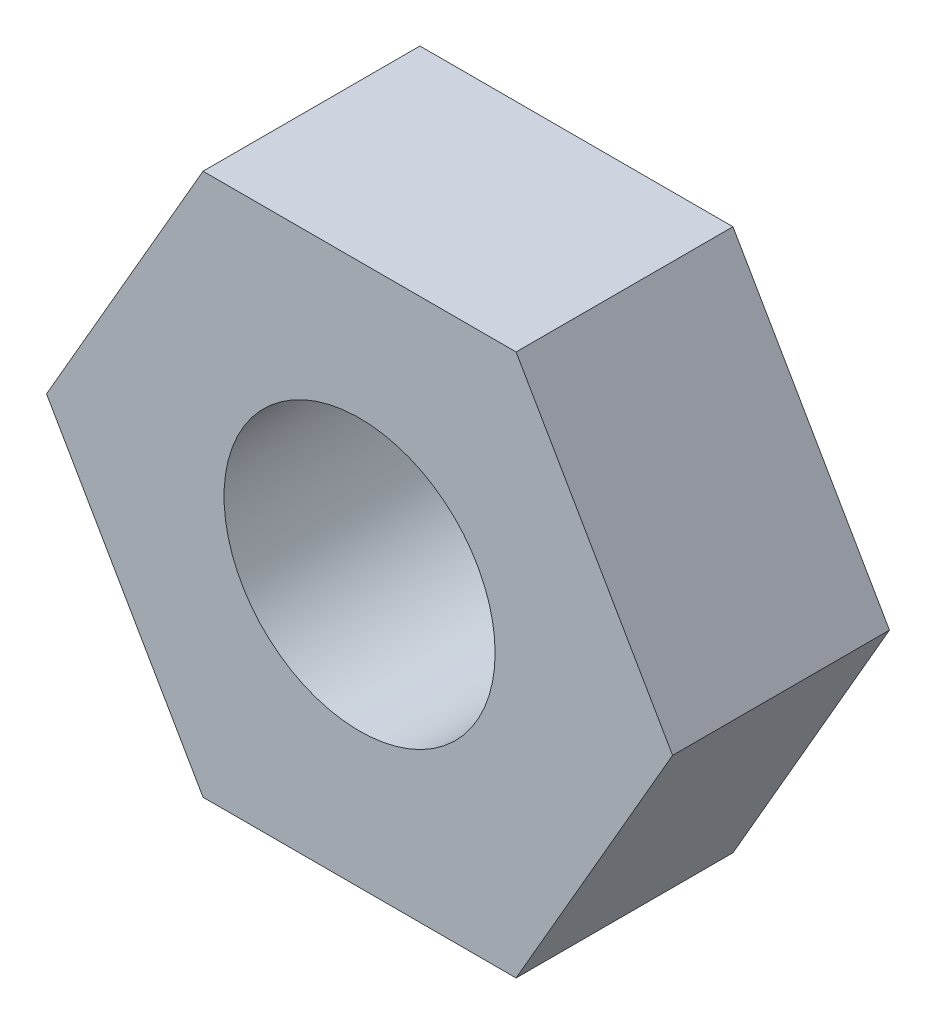
ISO-10303-21;
HEADER;
FILE_DESCRIPTION(('STEP AP214'),'2;1');
FILE_NAME('part.step','',(''),(''),'','','');
FILE_SCHEMA(('AUTOMOTIVE_DESIGN { 1 0 10303 214 1 1 1 1 }'));
ENDSEC;
DATA;
#1=APPLICATION_CONTEXT('core data for automotive mechanical design processes');
#2=APPLICATION_PROTOCOL_DEFINITION('international standard','automotive_design',2000,#1);
#3=PRODUCT_CONTEXT('',#1,'mechanical');
#4=PRODUCT('Part','Part','',(#3));
#5=PRODUCT_RELATED_PRODUCT_CATEGORY('part','',(#4));
#6=PRODUCT_DEFINITION_FORMATION('','',#4);
#7=PRODUCT_DEFINITION_CONTEXT('part definition',#1,'design');
#8=PRODUCT_DEFINITION('design','',#6,#7);
#9=PRODUCT_DEFINITION_SHAPE('','',#8);
#10=(LENGTH_UNIT() NAMED_UNIT(*) SI_UNIT(.MILLI.,.METRE.));
#11=(NAMED_UNIT(*) PLANE_ANGLE_UNIT() SI_UNIT($,.RADIAN.));
#12=(NAMED_UNIT(*) SI_UNIT($,.STERADIAN.) SOLID_ANGLE_UNIT());
#13=UNCERTAINTY_MEASURE_WITH_UNIT(LENGTH_MEASURE(1.E-05),#10,'distance_accuracy_value','');
#14=(GEOMETRIC_REPRESENTATION_CONTEXT(3) GLOBAL_UNCERTAINTY_ASSIGNED_CONTEXT((#13)) GLOBAL_UNIT_ASSIGNED_CONTEXT((#10,
#11,#12)) REPRESENTATION_CONTEXT('',''));
#15=CARTESIAN_POINT('',(0.,0.,0.));
#16=DIRECTION('',(0.,0.,1.));
#17=DIRECTION('',(1.,0.,0.));
#18=AXIS2_PLACEMENT_3D('',#15,#16,#17);
#19=CARTESIAN_POINT('',(0.,0.,1.6));
#20=DIRECTION('',(0.,0.,1.));
#21=DIRECTION('',(1.,0.,0.));
#22=AXIS2_PLACEMENT_3D('',#19,#20,#21);
#23=PLANE('',#22);
#24=DIRECTION('',(0.5,0.866025403784439,0.));
#25=VECTOR('',#24,1.);
#26=CARTESIAN_POINT('',(1.15470053837925,-2.,1.6));
#27=LINE('',#26,#25);
#28=CARTESIAN_POINT('',(1.15470053837925,-2.,1.6));
#29=VERTEX_POINT('',#28);
#30=CARTESIAN_POINT('',(2.3094010767585,0.,1.6));
#31=VERTEX_POINT('',#30);
#32=EDGE_CURVE('E134',#29,#31,#27,.T.);
#33=ORIENTED_EDGE('',*,*,#32,.T.);
#34=DIRECTION('',(-0.5,0.866025403784439,0.));
#35=VECTOR('',#34,1.);
#36=CARTESIAN_POINT('',(2.3094010767585,0.,1.6));
#37=LINE('',#36,#35);
#38=CARTESIAN_POINT('',(1.15470053837925,2.,1.6));
#39=VERTEX_POINT('',#38);
#40=EDGE_CURVE('E93',#31,#39,#37,.T.);
#41=ORIENTED_EDGE('',*,*,#40,.T.);
#42=DIRECTION('',(-1.,0.,0.));
#43=VECTOR('',#42,1.);
#44=CARTESIAN_POINT('',(1.15470053837925,2.,1.6));
#45=LINE('',#44,#43);
#46=CARTESIAN_POINT('',(-1.15470053837925,2.,1.6));
#47=VERTEX_POINT('',#46);
#48=EDGE_CURVE('E106',#39,#47,#45,.T.);
#49=ORIENTED_EDGE('',*,*,#48,.T.);
#50=DIRECTION('',(-0.5,-0.866025403784439,0.));
#51=VECTOR('',#50,1.);
#52=CARTESIAN_POINT('',(-1.15470053837925,2.,1.6));
#53=LINE('',#52,#51);
#54=CARTESIAN_POINT('',(-2.3094010767585,0.,1.6));
#55=VERTEX_POINT('',#54);
#56=EDGE_CURVE('E99',#47,#55,#53,.T.);
#57=ORIENTED_EDGE('',*,*,#56,.T.);
#58=DIRECTION('',(0.5,-0.866025403784439,0.));
#59=VECTOR('',#58,1.);
#60=CARTESIAN_POINT('',(-2.3094010767585,0.,1.6));
#61=LINE('',#60,#59);
#62=CARTESIAN_POINT('',(-1.15470053837925,-2.,1.6));
#63=VERTEX_POINT('',#62);
#64=EDGE_CURVE('E104',#55,#63,#61,.T.);
#65=ORIENTED_EDGE('',*,*,#64,.T.);
#66=DIRECTION('',(1.,0.,0.));
#67=VECTOR('',#66,1.);
#68=CARTESIAN_POINT('',(-1.15470053837925,-2.,1.6));
#69=LINE('',#68,#67);
#70=EDGE_CURVE('E57',#63,#29,#69,.T.);
#71=ORIENTED_EDGE('',*,*,#70,.T.);
#72=EDGE_LOOP('',(#33,#41,#49,#57,#65,#71));
#73=FACE_BOUND('',#72,.T.);
#74=CARTESIAN_POINT('',(0.,0.,1.6));
#75=DIRECTION('',(0.,0.,1.));
#76=DIRECTION('',(1.,0.,0.));
#77=AXIS2_PLACEMENT_3D('',#74,#75,#76);
#78=CIRCLE('',#77,1.);
#79=CARTESIAN_POINT('',(1.,0.,1.6));
#80=VERTEX_POINT('',#79);
#81=EDGE_CURVE('E127',#80,#80,#78,.T.);
#82=ORIENTED_EDGE('',*,*,#81,.F.);
#83=EDGE_LOOP('',(#82));
#84=FACE_BOUND('',#83,.T.);
#85=ADVANCED_FACE('F39',(#73,#84),#23,.T.);
#86=CARTESIAN_POINT('',(0.,0.,0.));
#87=DIRECTION('',(0.,0.,1.));
#88=DIRECTION('',(1.,0.,0.));
#89=AXIS2_PLACEMENT_3D('',#86,#87,#88);
#90=PLANE('',#89);
#91=DIRECTION('',(0.5,0.866025403784439,0.));
#92=VECTOR('',#91,1.);
#93=CARTESIAN_POINT('',(1.15470053837925,-2.,0.));
#94=LINE('',#93,#92);
#95=CARTESIAN_POINT('',(1.15470053837925,-2.,0.));
#96=VERTEX_POINT('',#95);
#97=CARTESIAN_POINT('',(2.3094010767585,0.,0.));
#98=VERTEX_POINT('',#97);
#99=EDGE_CURVE('E121',#96,#98,#94,.T.);
#100=ORIENTED_EDGE('',*,*,#99,.F.);
#101=DIRECTION('',(1.,0.,0.));
#102=VECTOR('',#101,1.);
#103=CARTESIAN_POINT('',(-1.15470053837925,-2.,0.));
#104=LINE('',#103,#102);
#105=CARTESIAN_POINT('',(-1.15470053837925,-2.,0.));
#106=VERTEX_POINT('',#105);
#107=EDGE_CURVE('E84',#106,#96,#104,.T.);
#108=ORIENTED_EDGE('',*,*,#107,.F.);
#109=DIRECTION('',(0.5,-0.866025403784439,0.));
#110=VECTOR('',#109,1.);
#111=CARTESIAN_POINT('',(-2.3094010767585,0.,0.));
#112=LINE('',#111,#110);
#113=CARTESIAN_POINT('',(-2.3094010767585,0.,0.));
#114=VERTEX_POINT('',#113);
#115=EDGE_CURVE('E79',#114,#106,#112,.T.);
#116=ORIENTED_EDGE('',*,*,#115,.F.);
#117=DIRECTION('',(-0.5,-0.866025403784439,0.));
#118=VECTOR('',#117,1.);
#119=CARTESIAN_POINT('',(-1.15470053837925,2.,0.));
#120=LINE('',#119,#118);
#121=CARTESIAN_POINT('',(-1.15470053837925,2.,0.));
#122=VERTEX_POINT('',#121);
#123=EDGE_CURVE('E112',#122,#114,#120,.T.);
#124=ORIENTED_EDGE('',*,*,#123,.F.);
#125=DIRECTION('',(-1.,0.,0.));
#126=VECTOR('',#125,1.);
#127=CARTESIAN_POINT('',(1.15470053837925,2.,0.));
#128=LINE('',#127,#126);
#129=CARTESIAN_POINT('',(1.15470053837925,2.,0.));
#130=VERTEX_POINT('',#129);
#131=EDGE_CURVE('E129',#130,#122,#128,.T.);
#132=ORIENTED_EDGE('',*,*,#131,.F.);
#133=DIRECTION('',(-0.5,0.866025403784439,0.));
#134=VECTOR('',#133,1.);
#135=CARTESIAN_POINT('',(2.3094010767585,0.,0.));
#136=LINE('',#135,#134);
#137=EDGE_CURVE('E130',#98,#130,#136,.T.);
#138=ORIENTED_EDGE('',*,*,#137,.F.);
#139=EDGE_LOOP('',(#100,#108,#116,#124,#132,#138));
#140=FACE_BOUND('',#139,.T.);
#141=CARTESIAN_POINT('',(0.,0.,0.));
#142=DIRECTION('',(0.,0.,1.));
#143=DIRECTION('',(1.,0.,0.));
#144=AXIS2_PLACEMENT_3D('',#141,#142,#143);
#145=CIRCLE('',#144,1.);
#146=CARTESIAN_POINT('',(1.,0.,0.));
#147=VERTEX_POINT('',#146);
#148=EDGE_CURVE('E226',#147,#147,#145,.T.);
#149=ORIENTED_EDGE('',*,*,#148,.T.);
#150=EDGE_LOOP('',(#149));
#151=FACE_BOUND('',#150,.T.);
#152=ADVANCED_FACE('F144',(#140,#151),#90,.F.);
#153=CARTESIAN_POINT('',(1.15470053837925,-2.,1.6));
#154=DIRECTION('',(-0.866025403784439,0.5,0.));
#155=DIRECTION('',(-0.5,-0.866025403784439,0.));
#156=AXIS2_PLACEMENT_3D('',#153,#154,#155);
#157=PLANE('',#156);
#158=ORIENTED_EDGE('',*,*,#99,.T.);
#159=DIRECTION('',(0.,0.,-1.));
#160=VECTOR('',#159,1.);
#161=CARTESIAN_POINT('',(2.3094010767585,0.,1.6));
#162=LINE('',#161,#160);
#163=EDGE_CURVE('E11',#31,#98,#162,.T.);
#164=ORIENTED_EDGE('',*,*,#163,.F.);
#165=ORIENTED_EDGE('',*,*,#32,.F.);
#166=DIRECTION('',(0.,0.,-1.));
#167=VECTOR('',#166,1.);
#168=CARTESIAN_POINT('',(1.15470053837925,-2.,1.6));
#169=LINE('',#168,#167);
#170=EDGE_CURVE('E119',#29,#96,#169,.T.);
#171=ORIENTED_EDGE('',*,*,#170,.T.);
#172=EDGE_LOOP('',(#158,#164,#165,#171));
#173=FACE_BOUND('',#172,.T.);
#174=ADVANCED_FACE('F41',(#173),#157,.F.);
#175=CARTESIAN_POINT('',(2.3094010767585,0.,1.6));
#176=DIRECTION('',(-0.866025403784439,-0.5,0.));
#177=DIRECTION('',(0.5,-0.866025403784439,0.));
#178=AXIS2_PLACEMENT_3D('',#175,#176,#177);
#179=PLANE('',#178);
#180=ORIENTED_EDGE('',*,*,#137,.T.);
#181=DIRECTION('',(0.,0.,-1.));
#182=VECTOR('',#181,1.);
#183=CARTESIAN_POINT('',(1.15470053837925,2.,1.6));
#184=LINE('',#183,#182);
#185=EDGE_CURVE('E48',#39,#130,#184,.T.);
#186=ORIENTED_EDGE('',*,*,#185,.F.);
#187=ORIENTED_EDGE('',*,*,#40,.F.);
#188=ORIENTED_EDGE('',*,*,#163,.T.);
#189=EDGE_LOOP('',(#180,#186,#187,#188));
#190=FACE_BOUND('',#189,.T.);
#191=ADVANCED_FACE('F169',(#190),#179,.F.);
#192=CARTESIAN_POINT('',(1.15470053837925,2.,1.6));
#193=DIRECTION('',(0.,-1.,0.));
#194=DIRECTION('',(1.,0.,0.));
#195=AXIS2_PLACEMENT_3D('',#192,#193,#194);
#196=PLANE('',#195);
#197=ORIENTED_EDGE('',*,*,#131,.T.);
#198=DIRECTION('',(0.,0.,-1.));
#199=VECTOR('',#198,1.);
#200=CARTESIAN_POINT('',(-1.15470053837925,2.,1.6));
#201=LINE('',#200,#199);
#202=EDGE_CURVE('E114',#47,#122,#201,.T.);
#203=ORIENTED_EDGE('',*,*,#202,.F.);
#204=ORIENTED_EDGE('',*,*,#48,.F.);
#205=ORIENTED_EDGE('',*,*,#185,.T.);
#206=EDGE_LOOP('',(#197,#203,#204,#205));
#207=FACE_BOUND('',#206,.T.);
#208=ADVANCED_FACE('F142',(#207),#196,.F.);
#209=CARTESIAN_POINT('',(-1.15470053837925,2.,1.6));
#210=DIRECTION('',(0.866025403784439,-0.5,0.));
#211=DIRECTION('',(0.5,0.866025403784439,0.));
#212=AXIS2_PLACEMENT_3D('',#209,#210,#211);
#213=PLANE('',#212);
#214=ORIENTED_EDGE('',*,*,#123,.T.);
#215=DIRECTION('',(0.,0.,-1.));
#216=VECTOR('',#215,1.);
#217=CARTESIAN_POINT('',(-2.3094010767585,0.,1.6));
#218=LINE('',#217,#216);
#219=EDGE_CURVE('E111',#55,#114,#218,.T.);
#220=ORIENTED_EDGE('',*,*,#219,.F.);
#221=ORIENTED_EDGE('',*,*,#56,.F.);
#222=ORIENTED_EDGE('',*,*,#202,.T.);
#223=EDGE_LOOP('',(#214,#220,#221,#222));
#224=FACE_BOUND('',#223,.T.);
#225=ADVANCED_FACE('F115',(#224),#213,.F.);
#226=CARTESIAN_POINT('',(-2.3094010767585,0.,1.6));
#227=DIRECTION('',(0.866025403784439,0.5,0.));
#228=DIRECTION('',(-0.5,0.866025403784439,0.));
#229=AXIS2_PLACEMENT_3D('',#226,#227,#228);
#230=PLANE('',#229);
#231=ORIENTED_EDGE('',*,*,#115,.T.);
#232=DIRECTION('',(0.,0.,-1.));
#233=VECTOR('',#232,1.);
#234=CARTESIAN_POINT('',(-1.15470053837925,-2.,1.6));
#235=LINE('',#234,#233);
#236=EDGE_CURVE('E116',#63,#106,#235,.T.);
#237=ORIENTED_EDGE('',*,*,#236,.F.);
#238=ORIENTED_EDGE('',*,*,#64,.F.);
#239=ORIENTED_EDGE('',*,*,#219,.T.);
#240=EDGE_LOOP('',(#231,#237,#238,#239));
#241=FACE_BOUND('',#240,.T.);
#242=ADVANCED_FACE('F117',(#241),#230,.F.);
#243=CARTESIAN_POINT('',(-1.15470053837925,-2.,1.6));
#244=DIRECTION('',(0.,1.,0.));
#245=DIRECTION('',(0.,0.,1.));
#246=AXIS2_PLACEMENT_3D('',#243,#244,#245);
#247=PLANE('',#246);
#248=ORIENTED_EDGE('',*,*,#107,.T.);
#249=ORIENTED_EDGE('',*,*,#170,.F.);
#250=ORIENTED_EDGE('',*,*,#70,.F.);
#251=ORIENTED_EDGE('',*,*,#236,.T.);
#252=EDGE_LOOP('',(#248,#249,#250,#251));
#253=FACE_BOUND('',#252,.T.);
#254=ADVANCED_FACE('F148',(#253),#247,.F.);
#255=CARTESIAN_POINT('',(0.,0.,1.6));
#256=DIRECTION('',(0.,0.,-1.));
#257=DIRECTION('',(-1.,0.,0.));
#258=AXIS2_PLACEMENT_3D('',#255,#256,#257);
#259=CYLINDRICAL_SURFACE('',#258,1.);
#260=ORIENTED_EDGE('',*,*,#81,.T.);
#261=EDGE_LOOP('',(#260));
#262=FACE_BOUND('',#261,.T.);
#263=ORIENTED_EDGE('',*,*,#148,.F.);
#264=EDGE_LOOP('',(#263));
#265=FACE_BOUND('',#264,.T.);
#266=ADVANCED_FACE('F151',(#262,#265),#259,.F.);
#267=CLOSED_SHELL('',(#85,#152,#174,#191,#208,#225,#242,#254,#266));
#268=MANIFOLD_SOLID_BREP('B2',#267);
#269=ADVANCED_BREP_SHAPE_REPRESENTATION('',(#18,#268),#14);
#270=SHAPE_DEFINITION_REPRESENTATION(#9,#269);
ENDSEC;
END-ISO-10303-21;
